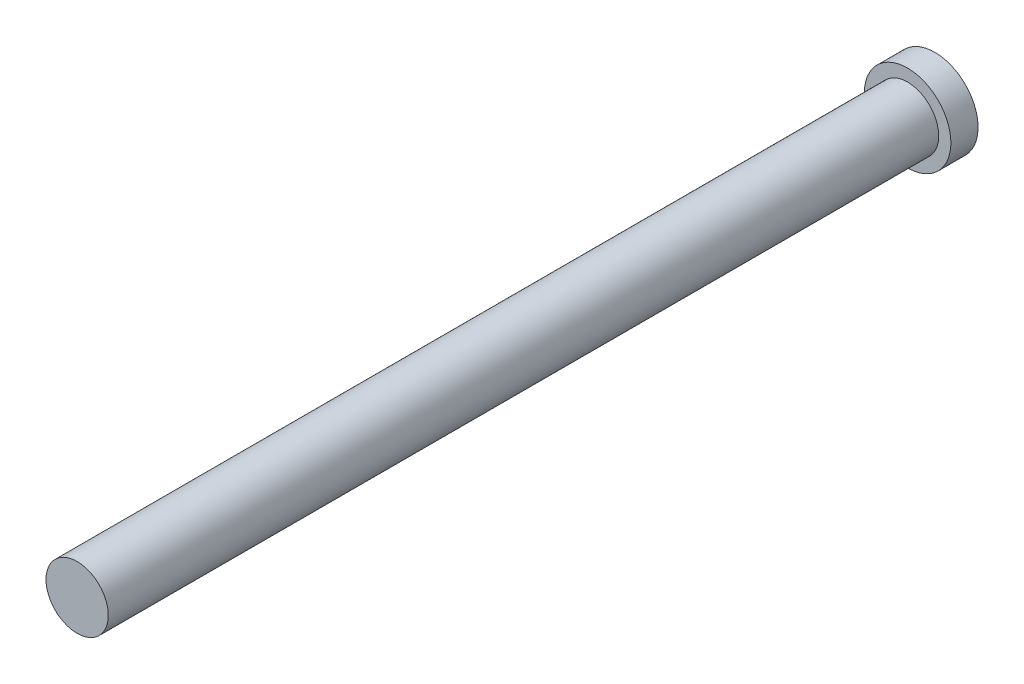
ISO-10303-21;
HEADER;
FILE_DESCRIPTION(('STEP AP214'),'2;1');
FILE_NAME('part.step','',(''),(''),'','','');
FILE_SCHEMA(('AUTOMOTIVE_DESIGN { 1 0 10303 214 1 1 1 1 }'));
ENDSEC;
DATA;
#1=APPLICATION_CONTEXT('core data for automotive mechanical design processes');
#2=APPLICATION_PROTOCOL_DEFINITION('international standard','automotive_design',2000,#1);
#3=PRODUCT_CONTEXT('',#1,'mechanical');
#4=PRODUCT('Part','Part','',(#3));
#5=PRODUCT_RELATED_PRODUCT_CATEGORY('part','',(#4));
#6=PRODUCT_DEFINITION_FORMATION('','',#4);
#7=PRODUCT_DEFINITION_CONTEXT('part definition',#1,'design');
#8=PRODUCT_DEFINITION('design','',#6,#7);
#9=PRODUCT_DEFINITION_SHAPE('','',#8);
#10=(LENGTH_UNIT() NAMED_UNIT(*) SI_UNIT(.MILLI.,.METRE.));
#11=(NAMED_UNIT(*) PLANE_ANGLE_UNIT() SI_UNIT($,.RADIAN.));
#12=(NAMED_UNIT(*) SI_UNIT($,.STERADIAN.) SOLID_ANGLE_UNIT());
#13=UNCERTAINTY_MEASURE_WITH_UNIT(LENGTH_MEASURE(1.E-05),#10,'distance_accuracy_value','');
#14=(GEOMETRIC_REPRESENTATION_CONTEXT(3) GLOBAL_UNCERTAINTY_ASSIGNED_CONTEXT((#13)) GLOBAL_UNIT_ASSIGNED_CONTEXT((#10,
#11,#12)) REPRESENTATION_CONTEXT('',''));
#15=CARTESIAN_POINT('',(0.,0.,0.));
#16=DIRECTION('',(0.,0.,1.));
#17=DIRECTION('',(1.,0.,0.));
#18=AXIS2_PLACEMENT_3D('',#15,#16,#17);
#19=CARTESIAN_POINT('',(0.,0.,30.48));
#20=DIRECTION('',(0.,0.,-1.));
#21=DIRECTION('',(-1.,0.,0.));
#22=AXIS2_PLACEMENT_3D('',#19,#20,#21);
#23=CYLINDRICAL_SURFACE('',#22,1.143);
#24=CARTESIAN_POINT('',(0.,0.,30.48));
#25=DIRECTION('',(0.,0.,1.));
#26=DIRECTION('',(1.,0.,0.));
#27=AXIS2_PLACEMENT_3D('',#24,#25,#26);
#28=CIRCLE('',#27,1.143);
#29=CARTESIAN_POINT('',(-1.143,0.,30.48));
#30=VERTEX_POINT('',#29);
#31=EDGE_CURVE('E10',#30,#30,#28,.T.);
#32=CARTESIAN_POINT('',(0.,0.,0.));
#33=DIRECTION('',(0.,0.,-1.));
#34=DIRECTION('',(-1.,0.,0.));
#35=AXIS2_PLACEMENT_3D('',#32,#33,#34);
#36=CIRCLE('',#35,1.143);
#37=CARTESIAN_POINT('',(-1.143,0.,0.));
#38=VERTEX_POINT('',#37);
#39=EDGE_CURVE('E39',#38,#38,#36,.T.);
#40=CARTESIAN_POINT('',(-1.143,0.,30.48));
#41=CARTESIAN_POINT('',(-1.143,0.,30.1625));
#42=CARTESIAN_POINT('',(-1.143,0.,29.845));
#43=CARTESIAN_POINT('',(-1.143,0.,29.21));
#44=CARTESIAN_POINT('',(-1.143,0.,28.8925));
#45=CARTESIAN_POINT('',(-1.143,0.,28.2575));
#46=CARTESIAN_POINT('',(-1.143,0.,27.94));
#47=CARTESIAN_POINT('',(-1.143,0.,27.305));
#48=CARTESIAN_POINT('',(-1.143,0.,26.9875));
#49=CARTESIAN_POINT('',(-1.143,0.,26.3525));
#50=CARTESIAN_POINT('',(-1.143,0.,26.035));
#51=CARTESIAN_POINT('',(-1.143,0.,25.4));
#52=CARTESIAN_POINT('',(-1.143,0.,25.0825));
#53=CARTESIAN_POINT('',(-1.143,0.,24.4475));
#54=CARTESIAN_POINT('',(-1.143,0.,24.13));
#55=CARTESIAN_POINT('',(-1.143,0.,23.495));
#56=CARTESIAN_POINT('',(-1.143,0.,23.1775));
#57=CARTESIAN_POINT('',(-1.143,0.,22.5425));
#58=CARTESIAN_POINT('',(-1.143,0.,22.225));
#59=CARTESIAN_POINT('',(-1.143,0.,21.59));
#60=CARTESIAN_POINT('',(-1.143,0.,21.2725));
#61=CARTESIAN_POINT('',(-1.143,0.,20.6375));
#62=CARTESIAN_POINT('',(-1.143,0.,20.32));
#63=CARTESIAN_POINT('',(-1.143,0.,19.685));
#64=CARTESIAN_POINT('',(-1.143,0.,19.3675));
#65=CARTESIAN_POINT('',(-1.143,0.,18.7325));
#66=CARTESIAN_POINT('',(-1.143,0.,18.415));
#67=CARTESIAN_POINT('',(-1.143,0.,17.78));
#68=CARTESIAN_POINT('',(-1.143,0.,17.4625));
#69=CARTESIAN_POINT('',(-1.143,0.,16.8275));
#70=CARTESIAN_POINT('',(-1.143,0.,16.51));
#71=CARTESIAN_POINT('',(-1.143,0.,15.875));
#72=CARTESIAN_POINT('',(-1.143,0.,15.5575));
#73=CARTESIAN_POINT('',(-1.143,0.,14.9225));
#74=CARTESIAN_POINT('',(-1.143,0.,14.605));
#75=CARTESIAN_POINT('',(-1.143,0.,13.97));
#76=CARTESIAN_POINT('',(-1.143,0.,13.6525));
#77=CARTESIAN_POINT('',(-1.143,0.,13.0175));
#78=CARTESIAN_POINT('',(-1.143,0.,12.7));
#79=CARTESIAN_POINT('',(-1.143,0.,12.065));
#80=CARTESIAN_POINT('',(-1.143,0.,11.7475));
#81=CARTESIAN_POINT('',(-1.143,0.,11.1125));
#82=CARTESIAN_POINT('',(-1.143,0.,10.795));
#83=CARTESIAN_POINT('',(-1.143,0.,10.16));
#84=CARTESIAN_POINT('',(-1.143,0.,9.8425));
#85=CARTESIAN_POINT('',(-1.143,0.,9.2075));
#86=CARTESIAN_POINT('',(-1.143,0.,8.89));
#87=CARTESIAN_POINT('',(-1.143,0.,8.255));
#88=CARTESIAN_POINT('',(-1.143,0.,7.9375));
#89=CARTESIAN_POINT('',(-1.143,0.,7.3025));
#90=CARTESIAN_POINT('',(-1.143,0.,6.985));
#91=CARTESIAN_POINT('',(-1.143,0.,6.35));
#92=CARTESIAN_POINT('',(-1.143,0.,6.0325));
#93=CARTESIAN_POINT('',(-1.143,0.,5.3975));
#94=CARTESIAN_POINT('',(-1.143,0.,5.08));
#95=CARTESIAN_POINT('',(-1.143,0.,4.445));
#96=CARTESIAN_POINT('',(-1.143,0.,4.1275));
#97=CARTESIAN_POINT('',(-1.143,0.,3.4925));
#98=CARTESIAN_POINT('',(-1.143,0.,3.175));
#99=CARTESIAN_POINT('',(-1.143,0.,2.54));
#100=CARTESIAN_POINT('',(-1.143,0.,2.2225));
#101=CARTESIAN_POINT('',(-1.143,0.,1.5875));
#102=CARTESIAN_POINT('',(-1.143,0.,1.27));
#103=CARTESIAN_POINT('',(-1.143,0.,0.634999999999999));
#104=CARTESIAN_POINT('',(-1.143,0.,0.3175));
#105=CARTESIAN_POINT('',(-1.143,0.,0.));
#106=B_SPLINE_CURVE_WITH_KNOTS('',3,(#40,#41,#42,#43,#44,#45,#46,#47,#48,#49,#50,#51,#52,#53,
#54,#55,#56,#57,#58,#59,#60,#61,#62,#63,#64,#65,#66,#67,#68,#69,#70,#71,#72,#73,#74,#75,#76,#77,
#78,#79,#80,#81,#82,#83,#84,#85,#86,#87,#88,#89,#90,#91,#92,#93,#94,#95,#96,#97,#98,#99,#100,
#101,#102,#103,#104,#105),.UNSPECIFIED.,.F.,.F.,(4,2,2,2,2,2,2,2,2,2,2,2,2,2,2,2,2,2,2,2,2,2,2,
2,2,2,2,2,2,2,2,2,4),(0.,0.952500000000002,1.905,2.8575,3.81,4.7625,5.715,6.6675,7.62,8.5725,
9.525,10.4775,11.43,12.3825,13.335,14.2875,15.24,16.1925,17.145,18.0975,19.05,20.0025,20.955,
21.9075,22.86,23.8125,24.765,25.7175,26.67,27.6225,28.575,29.5275,30.48),.UNSPECIFIED.);
#107=EDGE_CURVE('BSEAM33',#30,#38,#106,.T.);
#108=ORIENTED_EDGE('',*,*,#31,.F.);
#109=ORIENTED_EDGE('',*,*,#39,.F.);
#110=ORIENTED_EDGE('',*,*,#107,.T.);
#111=ORIENTED_EDGE('',*,*,#107,.F.);
#112=EDGE_LOOP('',(#108,#110,#109,#111));
#113=FACE_BOUND('',#112,.T.);
#114=ADVANCED_FACE('F33',(#113),#23,.T.);
#115=CARTESIAN_POINT('',(0.,0.,30.48));
#116=DIRECTION('',(0.,0.,1.));
#117=DIRECTION('',(1.,0.,0.));
#118=AXIS2_PLACEMENT_3D('',#115,#116,#117);
#119=PLANE('',#118);
#120=ORIENTED_EDGE('',*,*,#31,.T.);
#121=EDGE_LOOP('',(#120));
#122=FACE_BOUND('',#121,.T.);
#123=ADVANCED_FACE('F57',(#122),#119,.T.);
#124=CARTESIAN_POINT('',(0.,0.,0.));
#125=DIRECTION('',(0.,0.,-1.));
#126=DIRECTION('',(-1.,0.,0.));
#127=AXIS2_PLACEMENT_3D('',#124,#125,#126);
#128=PLANE('',#127);
#129=CARTESIAN_POINT('',(0.,0.,0.));
#130=DIRECTION('',(0.,0.,-1.));
#131=DIRECTION('',(-1.,0.,0.));
#132=AXIS2_PLACEMENT_3D('',#129,#130,#131);
#133=CIRCLE('',#132,1.5875);
#134=CARTESIAN_POINT('',(-1.5875,0.,0.));
#135=VERTEX_POINT('',#134);
#136=EDGE_CURVE('E47',#135,#135,#133,.T.);
#137=ORIENTED_EDGE('',*,*,#136,.F.);
#138=EDGE_LOOP('',(#137));
#139=FACE_BOUND('',#138,.T.);
#140=ORIENTED_EDGE('',*,*,#39,.T.);
#141=EDGE_LOOP('',(#140));
#142=FACE_BOUND('',#141,.T.);
#143=ADVANCED_FACE('F55',(#139,#142),#128,.F.);
#144=CARTESIAN_POINT('',(0.,0.,-1.));
#145=DIRECTION('',(0.,0.,1.));
#146=DIRECTION('',(1.,0.,0.));
#147=AXIS2_PLACEMENT_3D('',#144,#145,#146);
#148=CYLINDRICAL_SURFACE('',#147,1.5875);
#149=CARTESIAN_POINT('',(0.,0.,-1.));
#150=DIRECTION('',(0.,0.,-1.));
#151=DIRECTION('',(-1.,0.,0.));
#152=AXIS2_PLACEMENT_3D('',#149,#150,#151);
#153=CIRCLE('',#152,1.5875);
#154=CARTESIAN_POINT('',(-1.5875,0.,-1.));
#155=VERTEX_POINT('',#154);
#156=EDGE_CURVE('E43',#155,#155,#153,.T.);
#157=ORIENTED_EDGE('',*,*,#156,.F.);
#158=EDGE_LOOP('',(#157));
#159=FACE_BOUND('',#158,.T.);
#160=ORIENTED_EDGE('',*,*,#136,.T.);
#161=EDGE_LOOP('',(#160));
#162=FACE_BOUND('',#161,.T.);
#163=ADVANCED_FACE('F53',(#159,#162),#148,.T.);
#164=CARTESIAN_POINT('',(0.,0.,-1.));
#165=DIRECTION('',(0.,0.,-1.));
#166=DIRECTION('',(-1.,0.,0.));
#167=AXIS2_PLACEMENT_3D('',#164,#165,#166);
#168=PLANE('',#167);
#169=ORIENTED_EDGE('',*,*,#156,.T.);
#170=EDGE_LOOP('',(#169));
#171=FACE_BOUND('',#170,.T.);
#172=ADVANCED_FACE('F63',(#171),#168,.T.);
#173=CLOSED_SHELL('',(#114,#123,#143,#163,#172));
#174=MANIFOLD_SOLID_BREP('B2',#173);
#175=ADVANCED_BREP_SHAPE_REPRESENTATION('',(#18,#174),#14);
#176=SHAPE_DEFINITION_REPRESENTATION(#9,#175);
ENDSEC;
END-ISO-10303-21;
